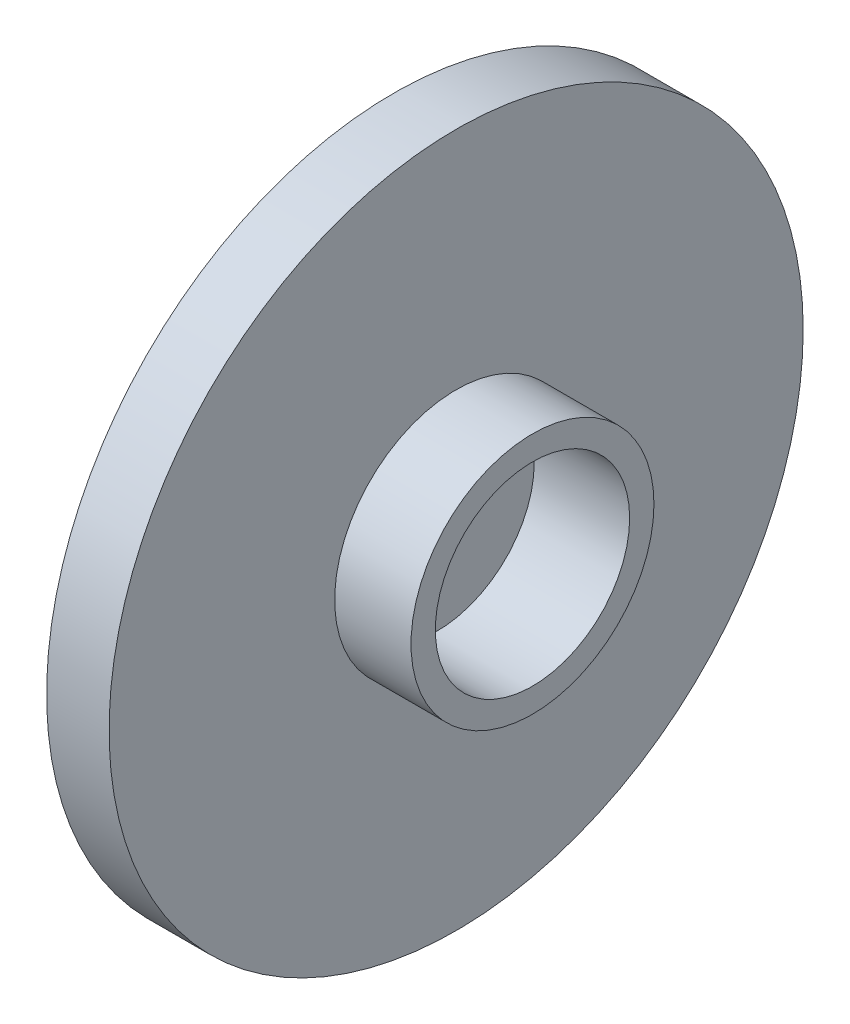
ISO-10303-21;
HEADER;
FILE_DESCRIPTION(('STEP AP214'),'2;1');
FILE_NAME('part.step','',(''),(''),'','','');
FILE_SCHEMA(('AUTOMOTIVE_DESIGN { 1 0 10303 214 1 1 1 1 }'));
ENDSEC;
DATA;
#1=APPLICATION_CONTEXT('core data for automotive mechanical design processes');
#2=APPLICATION_PROTOCOL_DEFINITION('international standard','automotive_design',2000,#1);
#3=PRODUCT_CONTEXT('',#1,'mechanical');
#4=PRODUCT('Part','Part','',(#3));
#5=PRODUCT_RELATED_PRODUCT_CATEGORY('part','',(#4));
#6=PRODUCT_DEFINITION_FORMATION('','',#4);
#7=PRODUCT_DEFINITION_CONTEXT('part definition',#1,'design');
#8=PRODUCT_DEFINITION('design','',#6,#7);
#9=PRODUCT_DEFINITION_SHAPE('','',#8);
#10=(LENGTH_UNIT() NAMED_UNIT(*) SI_UNIT(.MILLI.,.METRE.));
#11=(NAMED_UNIT(*) PLANE_ANGLE_UNIT() SI_UNIT($,.RADIAN.));
#12=(NAMED_UNIT(*) SI_UNIT($,.STERADIAN.) SOLID_ANGLE_UNIT());
#13=UNCERTAINTY_MEASURE_WITH_UNIT(LENGTH_MEASURE(1.E-05),#10,'distance_accuracy_value','');
#14=(GEOMETRIC_REPRESENTATION_CONTEXT(3) GLOBAL_UNCERTAINTY_ASSIGNED_CONTEXT((#13)) GLOBAL_UNIT_ASSIGNED_CONTEXT((#10,
#11,#12)) REPRESENTATION_CONTEXT('',''));
#15=CARTESIAN_POINT('',(0.,0.,0.));
#16=DIRECTION('',(0.,0.,1.));
#17=DIRECTION('',(1.,0.,0.));
#18=AXIS2_PLACEMENT_3D('',#15,#16,#17);
#19=CARTESIAN_POINT('',(-3.6,0.,-1.));
#20=DIRECTION('',(-1.,0.,0.));
#21=DIRECTION('',(0.,0.,1.));
#22=AXIS2_PLACEMENT_3D('',#19,#20,#21);
#23=PLANE('',#22);
#24=CARTESIAN_POINT('',(-3.6,0.,0.));
#25=DIRECTION('',(1.,0.,0.));
#26=DIRECTION('',(0.,0.,-1.));
#27=AXIS2_PLACEMENT_3D('',#24,#25,#26);
#28=CIRCLE('',#27,1.);
#29=CARTESIAN_POINT('',(-3.6,0.,-1.));
#30=VERTEX_POINT('',#29);
#31=EDGE_CURVE('E10',#30,#30,#28,.T.);
#32=ORIENTED_EDGE('',*,*,#31,.T.);
#33=EDGE_LOOP('',(#32));
#34=FACE_BOUND('',#33,.T.);
#35=CARTESIAN_POINT('',(-3.6,0.,0.));
#36=DIRECTION('',(1.,0.,0.));
#37=DIRECTION('',(0.,0.,-1.));
#38=AXIS2_PLACEMENT_3D('',#35,#36,#37);
#39=CIRCLE('',#38,2.25);
#40=CARTESIAN_POINT('',(-3.6,0.,-2.25));
#41=VERTEX_POINT('',#40);
#42=EDGE_CURVE('E73',#41,#41,#39,.T.);
#43=ORIENTED_EDGE('',*,*,#42,.F.);
#44=EDGE_LOOP('',(#43));
#45=FACE_BOUND('',#44,.T.);
#46=ADVANCED_FACE('F33',(#34,#45),#23,.T.);
#47=CARTESIAN_POINT('',(0.,0.,0.));
#48=DIRECTION('',(1.,0.,0.));
#49=DIRECTION('',(0.,0.,-1.));
#50=AXIS2_PLACEMENT_3D('',#47,#48,#49);
#51=CYLINDRICAL_SURFACE('',#50,1.);
#52=CARTESIAN_POINT('',(-2.75,0.,0.));
#53=DIRECTION('',(1.,0.,0.));
#54=DIRECTION('',(0.,0.,-1.));
#55=AXIS2_PLACEMENT_3D('',#52,#53,#54);
#56=CIRCLE('',#55,0.999999999999999);
#57=CARTESIAN_POINT('',(-2.75,0.,-0.999999999999999));
#58=VERTEX_POINT('',#57);
#59=EDGE_CURVE('E39',#58,#58,#56,.T.);
#60=ORIENTED_EDGE('',*,*,#59,.T.);
#61=EDGE_LOOP('',(#60));
#62=FACE_BOUND('',#61,.T.);
#63=ORIENTED_EDGE('',*,*,#31,.F.);
#64=EDGE_LOOP('',(#63));
#65=FACE_BOUND('',#64,.T.);
#66=ADVANCED_FACE('F81',(#62,#65),#51,.F.);
#67=CARTESIAN_POINT('',(-2.75,0.,-2.8));
#68=DIRECTION('',(1.,0.,0.));
#69=DIRECTION('',(0.,0.,-1.));
#70=AXIS2_PLACEMENT_3D('',#67,#68,#69);
#71=PLANE('',#70);
#72=CARTESIAN_POINT('',(-2.75,0.,0.));
#73=DIRECTION('',(1.,0.,0.));
#74=DIRECTION('',(0.,0.,-1.));
#75=AXIS2_PLACEMENT_3D('',#72,#73,#74);
#76=CIRCLE('',#75,2.8);
#77=CARTESIAN_POINT('',(-2.75,0.,-2.8));
#78=VERTEX_POINT('',#77);
#79=EDGE_CURVE('E43',#78,#78,#76,.T.);
#80=ORIENTED_EDGE('',*,*,#79,.T.);
#81=EDGE_LOOP('',(#80));
#82=FACE_BOUND('',#81,.T.);
#83=ORIENTED_EDGE('',*,*,#59,.F.);
#84=EDGE_LOOP('',(#83));
#85=FACE_BOUND('',#84,.T.);
#86=ADVANCED_FACE('F85',(#82,#85),#71,.T.);
#87=CARTESIAN_POINT('',(0.,0.,0.));
#88=DIRECTION('',(1.,0.,0.));
#89=DIRECTION('',(0.,0.,-1.));
#90=AXIS2_PLACEMENT_3D('',#87,#88,#89);
#91=CYLINDRICAL_SURFACE('',#90,2.8);
#92=CARTESIAN_POINT('',(0.,0.,0.));
#93=DIRECTION('',(1.,0.,0.));
#94=DIRECTION('',(0.,0.,-1.));
#95=AXIS2_PLACEMENT_3D('',#92,#93,#94);
#96=CIRCLE('',#95,2.8);
#97=CARTESIAN_POINT('',(0.,0.,-2.8));
#98=VERTEX_POINT('',#97);
#99=EDGE_CURVE('E47',#98,#98,#96,.T.);
#100=ORIENTED_EDGE('',*,*,#99,.T.);
#101=EDGE_LOOP('',(#100));
#102=FACE_BOUND('',#101,.T.);
#103=ORIENTED_EDGE('',*,*,#79,.F.);
#104=EDGE_LOOP('',(#103));
#105=FACE_BOUND('',#104,.T.);
#106=ADVANCED_FACE('F89',(#102,#105),#91,.F.);
#107=CARTESIAN_POINT('',(0.,0.,-3.5));
#108=DIRECTION('',(1.,0.,0.));
#109=DIRECTION('',(0.,0.,-1.));
#110=AXIS2_PLACEMENT_3D('',#107,#108,#109);
#111=PLANE('',#110);
#112=CARTESIAN_POINT('',(0.,0.,0.));
#113=DIRECTION('',(1.,0.,0.));
#114=DIRECTION('',(0.,0.,-1.));
#115=AXIS2_PLACEMENT_3D('',#112,#113,#114);
#116=CIRCLE('',#115,3.5);
#117=CARTESIAN_POINT('',(0.,0.,-3.5));
#118=VERTEX_POINT('',#117);
#119=EDGE_CURVE('E52',#118,#118,#116,.T.);
#120=ORIENTED_EDGE('',*,*,#119,.T.);
#121=EDGE_LOOP('',(#120));
#122=FACE_BOUND('',#121,.T.);
#123=ORIENTED_EDGE('',*,*,#99,.F.);
#124=EDGE_LOOP('',(#123));
#125=FACE_BOUND('',#124,.T.);
#126=ADVANCED_FACE('F96',(#122,#125),#111,.T.);
#127=CARTESIAN_POINT('',(0.,0.,0.));
#128=DIRECTION('',(1.,0.,0.));
#129=DIRECTION('',(0.,0.,-1.));
#130=AXIS2_PLACEMENT_3D('',#127,#128,#129);
#131=CYLINDRICAL_SURFACE('',#130,3.5);
#132=CARTESIAN_POINT('',(-2.2,0.,0.));
#133=DIRECTION('',(1.,0.,0.));
#134=DIRECTION('',(0.,0.,-1.));
#135=AXIS2_PLACEMENT_3D('',#132,#133,#134);
#136=CIRCLE('',#135,3.5);
#137=CARTESIAN_POINT('',(-2.2,0.,-3.5));
#138=VERTEX_POINT('',#137);
#139=EDGE_CURVE('E55',#138,#138,#136,.T.);
#140=ORIENTED_EDGE('',*,*,#139,.T.);
#141=EDGE_LOOP('',(#140));
#142=FACE_BOUND('',#141,.T.);
#143=ORIENTED_EDGE('',*,*,#119,.F.);
#144=EDGE_LOOP('',(#143));
#145=FACE_BOUND('',#144,.T.);
#146=ADVANCED_FACE('F100',(#142,#145),#131,.T.);
#147=CARTESIAN_POINT('',(-2.2,0.,-10.));
#148=DIRECTION('',(1.,0.,0.));
#149=DIRECTION('',(0.,0.,-1.));
#150=AXIS2_PLACEMENT_3D('',#147,#148,#149);
#151=PLANE('',#150);
#152=CARTESIAN_POINT('',(-2.2,0.,0.));
#153=DIRECTION('',(1.,0.,0.));
#154=DIRECTION('',(0.,0.,-1.));
#155=AXIS2_PLACEMENT_3D('',#152,#153,#154);
#156=CIRCLE('',#155,10.);
#157=CARTESIAN_POINT('',(-2.2,0.,-10.));
#158=VERTEX_POINT('',#157);
#159=EDGE_CURVE('E58',#158,#158,#156,.T.);
#160=ORIENTED_EDGE('',*,*,#159,.T.);
#161=EDGE_LOOP('',(#160));
#162=FACE_BOUND('',#161,.T.);
#163=ORIENTED_EDGE('',*,*,#139,.F.);
#164=EDGE_LOOP('',(#163));
#165=FACE_BOUND('',#164,.T.);
#166=ADVANCED_FACE('F104',(#162,#165),#151,.T.);
#167=CARTESIAN_POINT('',(0.,0.,0.));
#168=DIRECTION('',(1.,0.,0.));
#169=DIRECTION('',(0.,0.,-1.));
#170=AXIS2_PLACEMENT_3D('',#167,#168,#169);
#171=CYLINDRICAL_SURFACE('',#170,10.);
#172=CARTESIAN_POINT('',(-4.,0.,0.));
#173=DIRECTION('',(1.,0.,0.));
#174=DIRECTION('',(0.,0.,-1.));
#175=AXIS2_PLACEMENT_3D('',#172,#173,#174);
#176=CIRCLE('',#175,10.);
#177=CARTESIAN_POINT('',(-4.,0.,-10.));
#178=VERTEX_POINT('',#177);
#179=EDGE_CURVE('E61',#178,#178,#176,.T.);
#180=ORIENTED_EDGE('',*,*,#179,.T.);
#181=EDGE_LOOP('',(#180));
#182=FACE_BOUND('',#181,.T.);
#183=ORIENTED_EDGE('',*,*,#159,.F.);
#184=EDGE_LOOP('',(#183));
#185=FACE_BOUND('',#184,.T.);
#186=ADVANCED_FACE('F108',(#182,#185),#171,.T.);
#187=CARTESIAN_POINT('',(-4.,0.,-2.8));
#188=DIRECTION('',(-1.,0.,0.));
#189=DIRECTION('',(0.,0.,1.));
#190=AXIS2_PLACEMENT_3D('',#187,#188,#189);
#191=PLANE('',#190);
#192=CARTESIAN_POINT('',(-4.,0.,0.));
#193=DIRECTION('',(1.,0.,0.));
#194=DIRECTION('',(0.,0.,-1.));
#195=AXIS2_PLACEMENT_3D('',#192,#193,#194);
#196=CIRCLE('',#195,2.8);
#197=CARTESIAN_POINT('',(-4.,0.,-2.8));
#198=VERTEX_POINT('',#197);
#199=EDGE_CURVE('E64',#198,#198,#196,.T.);
#200=ORIENTED_EDGE('',*,*,#199,.T.);
#201=EDGE_LOOP('',(#200));
#202=FACE_BOUND('',#201,.T.);
#203=ORIENTED_EDGE('',*,*,#179,.F.);
#204=EDGE_LOOP('',(#203));
#205=FACE_BOUND('',#204,.T.);
#206=ADVANCED_FACE('F112',(#202,#205),#191,.T.);
#207=CARTESIAN_POINT('',(0.,0.,0.));
#208=DIRECTION('',(1.,0.,0.));
#209=DIRECTION('',(0.,0.,-1.));
#210=AXIS2_PLACEMENT_3D('',#207,#208,#209);
#211=CYLINDRICAL_SURFACE('',#210,2.8);
#212=CARTESIAN_POINT('',(-4.6,0.,0.));
#213=DIRECTION('',(1.,0.,0.));
#214=DIRECTION('',(0.,0.,-1.));
#215=AXIS2_PLACEMENT_3D('',#212,#213,#214);
#216=CIRCLE('',#215,2.8);
#217=CARTESIAN_POINT('',(-4.6,0.,-2.8));
#218=VERTEX_POINT('',#217);
#219=EDGE_CURVE('E67',#218,#218,#216,.T.);
#220=ORIENTED_EDGE('',*,*,#219,.T.);
#221=EDGE_LOOP('',(#220));
#222=FACE_BOUND('',#221,.T.);
#223=ORIENTED_EDGE('',*,*,#199,.F.);
#224=EDGE_LOOP('',(#223));
#225=FACE_BOUND('',#224,.T.);
#226=ADVANCED_FACE('F116',(#222,#225),#211,.T.);
#227=CARTESIAN_POINT('',(-4.6,0.,-2.25));
#228=DIRECTION('',(-1.,0.,0.));
#229=DIRECTION('',(0.,0.,1.));
#230=AXIS2_PLACEMENT_3D('',#227,#228,#229);
#231=PLANE('',#230);
#232=CARTESIAN_POINT('',(-4.6,0.,0.));
#233=DIRECTION('',(1.,0.,0.));
#234=DIRECTION('',(0.,0.,-1.));
#235=AXIS2_PLACEMENT_3D('',#232,#233,#234);
#236=CIRCLE('',#235,2.25);
#237=CARTESIAN_POINT('',(-4.6,0.,-2.25));
#238=VERTEX_POINT('',#237);
#239=EDGE_CURVE('E70',#238,#238,#236,.T.);
#240=ORIENTED_EDGE('',*,*,#239,.T.);
#241=EDGE_LOOP('',(#240));
#242=FACE_BOUND('',#241,.T.);
#243=ORIENTED_EDGE('',*,*,#219,.F.);
#244=EDGE_LOOP('',(#243));
#245=FACE_BOUND('',#244,.T.);
#246=ADVANCED_FACE('F120',(#242,#245),#231,.T.);
#247=CARTESIAN_POINT('',(0.,0.,0.));
#248=DIRECTION('',(1.,0.,0.));
#249=DIRECTION('',(0.,0.,-1.));
#250=AXIS2_PLACEMENT_3D('',#247,#248,#249);
#251=CYLINDRICAL_SURFACE('',#250,2.25);
#252=ORIENTED_EDGE('',*,*,#42,.T.);
#253=EDGE_LOOP('',(#252));
#254=FACE_BOUND('',#253,.T.);
#255=ORIENTED_EDGE('',*,*,#239,.F.);
#256=EDGE_LOOP('',(#255));
#257=FACE_BOUND('',#256,.T.);
#258=ADVANCED_FACE('F77',(#254,#257),#251,.F.);
#259=CLOSED_SHELL('',(#46,#66,#86,#106,#126,#146,#166,#186,#206,#226,#246,#258));
#260=MANIFOLD_SOLID_BREP('B2',#259);
#261=ADVANCED_BREP_SHAPE_REPRESENTATION('',(#18,#260),#14);
#262=SHAPE_DEFINITION_REPRESENTATION(#9,#261);
ENDSEC;
END-ISO-10303-21;
